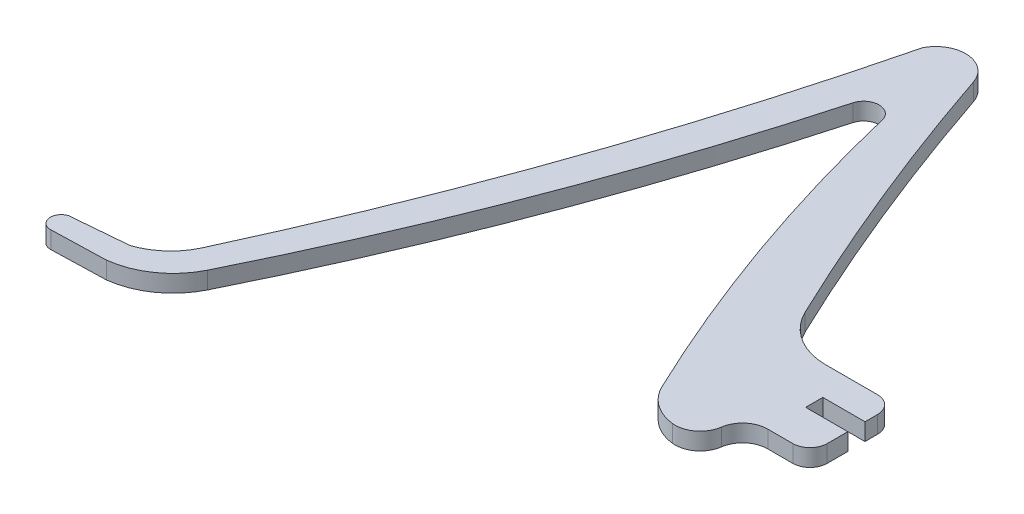
ISO-10303-21;
HEADER;
FILE_DESCRIPTION(('STEP AP214'),'2;1');
FILE_NAME('part.step','',(''),(''),'','','');
FILE_SCHEMA(('AUTOMOTIVE_DESIGN { 1 0 10303 214 1 1 1 1 }'));
ENDSEC;
DATA;
#1=APPLICATION_CONTEXT('core data for automotive mechanical design processes');
#2=APPLICATION_PROTOCOL_DEFINITION('international standard','automotive_design',2000,#1);
#3=PRODUCT_CONTEXT('',#1,'mechanical');
#4=PRODUCT('Part','Part','',(#3));
#5=PRODUCT_RELATED_PRODUCT_CATEGORY('part','',(#4));
#6=PRODUCT_DEFINITION_FORMATION('','',#4);
#7=PRODUCT_DEFINITION_CONTEXT('part definition',#1,'design');
#8=PRODUCT_DEFINITION('design','',#6,#7);
#9=PRODUCT_DEFINITION_SHAPE('','',#8);
#10=(LENGTH_UNIT() NAMED_UNIT(*) SI_UNIT(.MILLI.,.METRE.));
#11=(NAMED_UNIT(*) PLANE_ANGLE_UNIT() SI_UNIT($,.RADIAN.));
#12=(NAMED_UNIT(*) SI_UNIT($,.STERADIAN.) SOLID_ANGLE_UNIT());
#13=UNCERTAINTY_MEASURE_WITH_UNIT(LENGTH_MEASURE(1.E-05),#10,'distance_accuracy_value','');
#14=(GEOMETRIC_REPRESENTATION_CONTEXT(3) GLOBAL_UNCERTAINTY_ASSIGNED_CONTEXT((#13)) GLOBAL_UNIT_ASSIGNED_CONTEXT((#10,
#11,#12)) REPRESENTATION_CONTEXT('',''));
#15=CARTESIAN_POINT('',(0.,0.,0.));
#16=DIRECTION('',(0.,0.,1.));
#17=DIRECTION('',(1.,0.,0.));
#18=AXIS2_PLACEMENT_3D('',#15,#16,#17);
#19=CARTESIAN_POINT('',(-41735.625000019,3.,-18254.4492183755));
#20=DIRECTION('',(0.,-1.,0.));
#21=DIRECTION('',(0.,0.,-1.));
#22=AXIS2_PLACEMENT_3D('',#19,#20,#21);
#23=CYLINDRICAL_SURFACE('',#22,1.87725105910112);
#24=CARTESIAN_POINT('',(-41735.625000019,0.,-18254.4492183755));
#25=DIRECTION('',(0.,1.,0.));
#26=DIRECTION('',(0.,0.,1.));
#27=AXIS2_PLACEMENT_3D('',#24,#25,#26);
#28=CIRCLE('',#27,1.87725105910112);
#29=CARTESIAN_POINT('',(-41735.457558,0.,-18256.318987));
#30=VERTEX_POINT('',#29);
#31=CARTESIAN_POINT('',(-41735.572271,0.,-18252.572708));
#32=VERTEX_POINT('',#31);
#33=EDGE_CURVE('E227',#30,#32,#28,.T.);
#34=ORIENTED_EDGE('',*,*,#33,.T.);
#35=DIRECTION('',(0.,-1.,0.));
#36=VECTOR('',#35,1.);
#37=CARTESIAN_POINT('',(-41735.572271,3.,-18252.572708));
#38=LINE('',#37,#36);
#39=CARTESIAN_POINT('',(-41735.572271,3.,-18252.572708));
#40=VERTEX_POINT('',#39);
#41=EDGE_CURVE('E11',#40,#32,#38,.T.);
#42=ORIENTED_EDGE('',*,*,#41,.F.);
#43=CARTESIAN_POINT('',(-41735.625000019,3.,-18254.4492183755));
#44=DIRECTION('',(0.,1.,0.));
#45=DIRECTION('',(0.,0.,1.));
#46=AXIS2_PLACEMENT_3D('',#43,#44,#45);
#47=CIRCLE('',#46,1.87725105910112);
#48=CARTESIAN_POINT('',(-41735.457558,3.,-18256.318987));
#49=VERTEX_POINT('',#48);
#50=EDGE_CURVE('E273',#49,#40,#47,.T.);
#51=ORIENTED_EDGE('',*,*,#50,.F.);
#52=DIRECTION('',(0.,-1.,0.));
#53=VECTOR('',#52,1.);
#54=CARTESIAN_POINT('',(-41735.457558,3.,-18256.318987));
#55=LINE('',#54,#53);
#56=EDGE_CURVE('E223',#49,#30,#55,.T.);
#57=ORIENTED_EDGE('',*,*,#56,.T.);
#58=EDGE_LOOP('',(#34,#42,#51,#57));
#59=FACE_BOUND('',#58,.T.);
#60=ADVANCED_FACE('F35',(#59),#23,.T.);
#61=CARTESIAN_POINT('',(-41735.572271,3.,-18252.572708));
#62=DIRECTION('',(-0.0283472099068102,0.,-0.999598137098354));
#63=DIRECTION('',(-0.999598137098354,0.,0.0283472099068102));
#64=AXIS2_PLACEMENT_3D('',#61,#62,#63);
#65=PLANE('',#64);
#66=DIRECTION('',(0.999598137098354,0.,-0.0283472099068102));
#67=VECTOR('',#66,1.);
#68=CARTESIAN_POINT('',(-41735.572271,0.,-18252.572708));
#69=LINE('',#68,#67);
#70=CARTESIAN_POINT('',(-41726.152344,0.,-18252.839844));
#71=VERTEX_POINT('',#70);
#72=EDGE_CURVE('E230',#32,#71,#69,.T.);
#73=ORIENTED_EDGE('',*,*,#72,.T.);
#74=DIRECTION('',(0.,-1.,0.));
#75=VECTOR('',#74,1.);
#76=CARTESIAN_POINT('',(-41726.152344,3.,-18252.839844));
#77=LINE('',#76,#75);
#78=CARTESIAN_POINT('',(-41726.152344,3.,-18252.839844));
#79=VERTEX_POINT('',#78);
#80=EDGE_CURVE('E43',#79,#71,#77,.T.);
#81=ORIENTED_EDGE('',*,*,#80,.F.);
#82=DIRECTION('',(0.999598137098354,0.,-0.0283472099068102));
#83=VECTOR('',#82,1.);
#84=CARTESIAN_POINT('',(-41735.572271,3.,-18252.572708));
#85=LINE('',#84,#83);
#86=EDGE_CURVE('E142',#40,#79,#85,.T.);
#87=ORIENTED_EDGE('',*,*,#86,.F.);
#88=ORIENTED_EDGE('',*,*,#41,.T.);
#89=EDGE_LOOP('',(#73,#81,#87,#88));
#90=FACE_BOUND('',#89,.T.);
#91=ADVANCED_FACE('F411',(#90),#65,.F.);
#92=CARTESIAN_POINT('',(-41727.6986479715,3.,-18266.0433719861));
#93=DIRECTION('',(0.,-1.,0.));
#94=DIRECTION('',(0.,0.,-1.));
#95=AXIS2_PLACEMENT_3D('',#92,#93,#94);
#96=CYLINDRICAL_SURFACE('',#95,13.2937657287983);
#97=CARTESIAN_POINT('',(-41727.6986479715,0.,-18266.0433719861));
#98=DIRECTION('',(0.,1.,0.));
#99=DIRECTION('',(0.,0.,1.));
#100=AXIS2_PLACEMENT_3D('',#97,#98,#99);
#101=CIRCLE('',#100,13.2937657287983);
#102=CARTESIAN_POINT('',(-41715.7765399999,0.,-18260.162254));
#103=VERTEX_POINT('',#102);
#104=EDGE_CURVE('E232',#71,#103,#101,.T.);
#105=ORIENTED_EDGE('',*,*,#104,.T.);
#106=DIRECTION('',(0.,-1.,0.));
#107=VECTOR('',#106,1.);
#108=CARTESIAN_POINT('',(-41715.7765399999,3.,-18260.162254));
#109=LINE('',#108,#107);
#110=CARTESIAN_POINT('',(-41715.7765399999,3.,-18260.162254));
#111=VERTEX_POINT('',#110);
#112=EDGE_CURVE('E328',#111,#103,#109,.T.);
#113=ORIENTED_EDGE('',*,*,#112,.F.);
#114=CARTESIAN_POINT('',(-41727.6986479715,3.,-18266.0433719861));
#115=DIRECTION('',(0.,1.,0.));
#116=DIRECTION('',(0.,0.,1.));
#117=AXIS2_PLACEMENT_3D('',#114,#115,#116);
#118=CIRCLE('',#117,13.2937657287983);
#119=EDGE_CURVE('E336',#79,#111,#118,.T.);
#120=ORIENTED_EDGE('',*,*,#119,.F.);
#121=ORIENTED_EDGE('',*,*,#80,.T.);
#122=EDGE_LOOP('',(#105,#113,#120,#121));
#123=FACE_BOUND('',#122,.T.);
#124=ADVANCED_FACE('F334',(#123),#96,.T.);
#125=CARTESIAN_POINT('',(-42128.6616567042,3.,-18463.785625262));
#126=DIRECTION('',(0.,-1.,0.));
#127=DIRECTION('',(0.,0.,-1.));
#128=AXIS2_PLACEMENT_3D('',#125,#126,#127);
#129=CYLINDRICAL_SURFACE('',#128,460.365720835098);
#130=CARTESIAN_POINT('',(-42128.6616567042,0.,-18463.785625262));
#131=DIRECTION('',(0.,1.,0.));
#132=DIRECTION('',(0.,0.,1.));
#133=AXIS2_PLACEMENT_3D('',#130,#131,#132);
#134=CIRCLE('',#133,460.365720835098);
#135=CARTESIAN_POINT('',(-41684.7636980001,0.,-18341.7561239999));
#136=VERTEX_POINT('',#135);
#137=EDGE_CURVE('E234',#103,#136,#134,.T.);
#138=ORIENTED_EDGE('',*,*,#137,.T.);
#139=DIRECTION('',(0.,-1.,0.));
#140=VECTOR('',#139,1.);
#141=CARTESIAN_POINT('',(-41684.7636980001,3.,-18341.7561239999));
#142=LINE('',#141,#140);
#143=CARTESIAN_POINT('',(-41684.7636980001,3.,-18341.7561239999));
#144=VERTEX_POINT('',#143);
#145=EDGE_CURVE('E325',#144,#136,#142,.T.);
#146=ORIENTED_EDGE('',*,*,#145,.F.);
#147=CARTESIAN_POINT('',(-42128.6616567042,3.,-18463.785625262));
#148=DIRECTION('',(0.,1.,0.));
#149=DIRECTION('',(0.,0.,1.));
#150=AXIS2_PLACEMENT_3D('',#147,#148,#149);
#151=CIRCLE('',#150,460.365720835098);
#152=EDGE_CURVE('E354',#111,#144,#151,.T.);
#153=ORIENTED_EDGE('',*,*,#152,.F.);
#154=ORIENTED_EDGE('',*,*,#112,.T.);
#155=EDGE_LOOP('',(#138,#146,#153,#154));
#156=FACE_BOUND('',#155,.T.);
#157=ADVANCED_FACE('F345',(#156),#129,.T.);
#158=CARTESIAN_POINT('',(-41682.171002211,3.,-18341.0430255174));
#159=DIRECTION('',(0.,-1.,0.));
#160=DIRECTION('',(0.,0.,-1.));
#161=AXIS2_PLACEMENT_3D('',#158,#159,#160);
#162=CYLINDRICAL_SURFACE('',#161,2.6889739493658);
#163=CARTESIAN_POINT('',(-41682.171002211,0.,-18341.0430255174));
#164=DIRECTION('',(0.,-1.,0.));
#165=DIRECTION('',(0.,0.,1.));
#166=AXIS2_PLACEMENT_3D('',#163,#164,#165);
#167=CIRCLE('',#166,2.6889739493658);
#168=CARTESIAN_POINT('',(-41679.691927,0.,-18342.084547));
#169=VERTEX_POINT('',#168);
#170=EDGE_CURVE('E236',#136,#169,#167,.T.);
#171=ORIENTED_EDGE('',*,*,#170,.T.);
#172=DIRECTION('',(0.,-1.,0.));
#173=VECTOR('',#172,1.);
#174=CARTESIAN_POINT('',(-41679.691927,3.,-18342.084547));
#175=LINE('',#174,#173);
#176=CARTESIAN_POINT('',(-41679.691927,3.,-18342.084547));
#177=VERTEX_POINT('',#176);
#178=EDGE_CURVE('E322',#177,#169,#175,.T.);
#179=ORIENTED_EDGE('',*,*,#178,.F.);
#180=CARTESIAN_POINT('',(-41682.171002211,3.,-18341.0430255174));
#181=DIRECTION('',(0.,-1.,0.));
#182=DIRECTION('',(0.,0.,1.));
#183=AXIS2_PLACEMENT_3D('',#180,#181,#182);
#184=CIRCLE('',#183,2.6889739493658);
#185=EDGE_CURVE('E351',#144,#177,#184,.T.);
#186=ORIENTED_EDGE('',*,*,#185,.F.);
#187=ORIENTED_EDGE('',*,*,#145,.T.);
#188=EDGE_LOOP('',(#171,#179,#186,#187));
#189=FACE_BOUND('',#188,.T.);
#190=ADVANCED_FACE('F349',(#189),#162,.F.);
#191=CARTESIAN_POINT('',(-41387.5740004208,3.,-18411.7109974859));
#192=DIRECTION('',(0.,-1.,0.));
#193=DIRECTION('',(0.,0.,-1.));
#194=AXIS2_PLACEMENT_3D('',#191,#192,#193);
#195=CYLINDRICAL_SURFACE('',#194,300.3010583335);
#196=CARTESIAN_POINT('',(-41387.5740004208,0.,-18411.7109974859));
#197=DIRECTION('',(0.,1.,0.));
#198=DIRECTION('',(0.,0.,1.));
#199=AXIS2_PLACEMENT_3D('',#196,#197,#198);
#200=CIRCLE('',#199,300.3010583335);
#201=CARTESIAN_POINT('',(-41658.4870259999,0.,-18282.1468889999));
#202=VERTEX_POINT('',#201);
#203=EDGE_CURVE('E238',#169,#202,#200,.T.);
#204=ORIENTED_EDGE('',*,*,#203,.T.);
#205=DIRECTION('',(0.,-1.,0.));
#206=VECTOR('',#205,1.);
#207=CARTESIAN_POINT('',(-41658.4870259999,3.,-18282.1468889999));
#208=LINE('',#207,#206);
#209=CARTESIAN_POINT('',(-41658.4870259999,3.,-18282.1468889999));
#210=VERTEX_POINT('',#209);
#211=EDGE_CURVE('E319',#210,#202,#208,.T.);
#212=ORIENTED_EDGE('',*,*,#211,.F.);
#213=CARTESIAN_POINT('',(-41387.5740004208,3.,-18411.7109974859));
#214=DIRECTION('',(0.,1.,0.));
#215=DIRECTION('',(0.,0.,1.));
#216=AXIS2_PLACEMENT_3D('',#213,#214,#215);
#217=CIRCLE('',#216,300.3010583335);
#218=EDGE_CURVE('E353',#177,#210,#217,.T.);
#219=ORIENTED_EDGE('',*,*,#218,.F.);
#220=ORIENTED_EDGE('',*,*,#178,.T.);
#221=EDGE_LOOP('',(#204,#212,#219,#220));
#222=FACE_BOUND('',#221,.T.);
#223=ADVANCED_FACE('F424',(#222),#195,.T.);
#224=CARTESIAN_POINT('',(-41651.1032537113,3.,-18285.6789434485));
#225=DIRECTION('',(0.,-1.,0.));
#226=DIRECTION('',(0.,0.,-1.));
#227=AXIS2_PLACEMENT_3D('',#224,#225,#226);
#228=CYLINDRICAL_SURFACE('',#227,8.1850779983004);
#229=CARTESIAN_POINT('',(-41651.1032537113,0.,-18285.6789434485));
#230=DIRECTION('',(0.,1.,0.));
#231=DIRECTION('',(0.,0.,1.));
#232=AXIS2_PLACEMENT_3D('',#229,#230,#231);
#233=CIRCLE('',#232,8.1850779983004);
#234=CARTESIAN_POINT('',(-41652.056541,0.,-18277.5495679999));
#235=VERTEX_POINT('',#234);
#236=EDGE_CURVE('E240',#202,#235,#233,.T.);
#237=ORIENTED_EDGE('',*,*,#236,.T.);
#238=DIRECTION('',(0.,-1.,0.));
#239=VECTOR('',#238,1.);
#240=CARTESIAN_POINT('',(-41652.056541,3.,-18277.5495679999));
#241=LINE('',#240,#239);
#242=CARTESIAN_POINT('',(-41652.056541,3.,-18277.5495679999));
#243=VERTEX_POINT('',#242);
#244=EDGE_CURVE('E316',#243,#235,#241,.T.);
#245=ORIENTED_EDGE('',*,*,#244,.F.);
#246=CARTESIAN_POINT('',(-41651.1032537113,3.,-18285.6789434485));
#247=DIRECTION('',(0.,1.,0.));
#248=DIRECTION('',(0.,0.,1.));
#249=AXIS2_PLACEMENT_3D('',#246,#247,#248);
#250=CIRCLE('',#249,8.1850779983004);
#251=EDGE_CURVE('E356',#210,#243,#250,.T.);
#252=ORIENTED_EDGE('',*,*,#251,.F.);
#253=ORIENTED_EDGE('',*,*,#211,.T.);
#254=EDGE_LOOP('',(#237,#245,#252,#253));
#255=FACE_BOUND('',#254,.T.);
#256=ADVANCED_FACE('F427',(#255),#228,.T.);
#257=CARTESIAN_POINT('',(-41651.5439153438,3.,-18281.889896786));
#258=DIRECTION('',(0.,-1.,0.));
#259=DIRECTION('',(0.,0.,-1.));
#260=AXIS2_PLACEMENT_3D('',#257,#258,#259);
#261=CYLINDRICAL_SURFACE('',#260,4.37049642879947);
#262=CARTESIAN_POINT('',(-41651.5439153438,0.,-18281.889896786));
#263=DIRECTION('',(0.,1.,0.));
#264=DIRECTION('',(0.,0.,1.));
#265=AXIS2_PLACEMENT_3D('',#262,#263,#264);
#266=CIRCLE('',#265,4.37049642879947);
#267=CARTESIAN_POINT('',(-41647.2171,0.,-18281.27353));
#268=VERTEX_POINT('',#267);
#269=EDGE_CURVE('E242',#235,#268,#266,.T.);
#270=ORIENTED_EDGE('',*,*,#269,.T.);
#271=DIRECTION('',(0.,-1.,0.));
#272=VECTOR('',#271,1.);
#273=CARTESIAN_POINT('',(-41647.2171,3.,-18281.27353));
#274=LINE('',#273,#272);
#275=CARTESIAN_POINT('',(-41647.2171,3.,-18281.27353));
#276=VERTEX_POINT('',#275);
#277=EDGE_CURVE('E313',#276,#268,#274,.T.);
#278=ORIENTED_EDGE('',*,*,#277,.F.);
#279=CARTESIAN_POINT('',(-41651.5439153438,3.,-18281.889896786));
#280=DIRECTION('',(0.,1.,0.));
#281=DIRECTION('',(0.,0.,1.));
#282=AXIS2_PLACEMENT_3D('',#279,#280,#281);
#283=CIRCLE('',#282,4.37049642879947);
#284=EDGE_CURVE('E362',#243,#276,#283,.T.);
#285=ORIENTED_EDGE('',*,*,#284,.F.);
#286=ORIENTED_EDGE('',*,*,#244,.T.);
#287=EDGE_LOOP('',(#270,#278,#285,#286));
#288=FACE_BOUND('',#287,.T.);
#289=ADVANCED_FACE('F431',(#288),#261,.T.);
#290=CARTESIAN_POINT('',(-41642.9057210753,3.,-18280.6586579535));
#291=DIRECTION('',(0.,-1.,0.));
#292=DIRECTION('',(0.,0.,-1.));
#293=AXIS2_PLACEMENT_3D('',#290,#291,#292);
#294=CYLINDRICAL_SURFACE('',#293,4.35500354371841);
#295=CARTESIAN_POINT('',(-41642.9057210753,0.,-18280.6586579535));
#296=DIRECTION('',(0.,-1.,0.));
#297=DIRECTION('',(0.,0.,1.));
#298=AXIS2_PLACEMENT_3D('',#295,#296,#297);
#299=CIRCLE('',#298,4.35500354371841);
#300=CARTESIAN_POINT('',(-41642.869038,0.,-18285.013507));
#301=VERTEX_POINT('',#300);
#302=EDGE_CURVE('E244',#268,#301,#299,.T.);
#303=ORIENTED_EDGE('',*,*,#302,.T.);
#304=DIRECTION('',(0.,-1.,0.));
#305=VECTOR('',#304,1.);
#306=CARTESIAN_POINT('',(-41642.869038,3.,-18285.013507));
#307=LINE('',#306,#305);
#308=CARTESIAN_POINT('',(-41642.869038,3.,-18285.013507));
#309=VERTEX_POINT('',#308);
#310=EDGE_CURVE('E310',#309,#301,#307,.T.);
#311=ORIENTED_EDGE('',*,*,#310,.F.);
#312=CARTESIAN_POINT('',(-41642.9057210753,3.,-18280.6586579535));
#313=DIRECTION('',(0.,-1.,0.));
#314=DIRECTION('',(0.,0.,1.));
#315=AXIS2_PLACEMENT_3D('',#312,#313,#314);
#316=CIRCLE('',#315,4.35500354371841);
#317=EDGE_CURVE('E364',#276,#309,#316,.T.);
#318=ORIENTED_EDGE('',*,*,#317,.F.);
#319=ORIENTED_EDGE('',*,*,#277,.T.);
#320=EDGE_LOOP('',(#303,#311,#318,#319));
#321=FACE_BOUND('',#320,.T.);
#322=ADVANCED_FACE('F435',(#321),#294,.F.);
#323=CARTESIAN_POINT('',(-41642.869038,3.,-18285.013507));
#324=DIRECTION('',(-3.77320231391761E-05,0.,-0.999999999288147));
#325=DIRECTION('',(-0.999999999288147,0.,3.77320231391761E-05));
#326=AXIS2_PLACEMENT_3D('',#323,#324,#325);
#327=PLANE('',#326);
#328=DIRECTION('',(0.999999999288147,0.,-3.77320231391761E-05));
#329=VECTOR('',#328,1.);
#330=CARTESIAN_POINT('',(-41642.869038,0.,-18285.013507));
#331=LINE('',#330,#329);
#332=CARTESIAN_POINT('',(-41638.496094,0.,-18285.013672));
#333=VERTEX_POINT('',#332);
#334=EDGE_CURVE('E246',#301,#333,#331,.T.);
#335=ORIENTED_EDGE('',*,*,#334,.T.);
#336=DIRECTION('',(0.,-1.,0.));
#337=VECTOR('',#336,1.);
#338=CARTESIAN_POINT('',(-41638.496094,3.,-18285.013672));
#339=LINE('',#338,#337);
#340=CARTESIAN_POINT('',(-41638.496094,3.,-18285.013672));
#341=VERTEX_POINT('',#340);
#342=EDGE_CURVE('E307',#341,#333,#339,.T.);
#343=ORIENTED_EDGE('',*,*,#342,.F.);
#344=DIRECTION('',(0.999999999288147,0.,-3.77320231391761E-05));
#345=VECTOR('',#344,1.);
#346=CARTESIAN_POINT('',(-41642.869038,3.,-18285.013507));
#347=LINE('',#346,#345);
#348=EDGE_CURVE('E366',#309,#341,#347,.T.);
#349=ORIENTED_EDGE('',*,*,#348,.F.);
#350=ORIENTED_EDGE('',*,*,#310,.T.);
#351=EDGE_LOOP('',(#335,#343,#349,#350));
#352=FACE_BOUND('',#351,.T.);
#353=ADVANCED_FACE('F439',(#352),#327,.F.);
#354=CARTESIAN_POINT('',(-41638.4970694779,3.,-18288.014648383));
#355=DIRECTION('',(0.,-1.,0.));
#356=DIRECTION('',(0.,0.,-1.));
#357=AXIS2_PLACEMENT_3D('',#354,#355,#356);
#358=CYLINDRICAL_SURFACE('',#357,3.00097654149968);
#359=CARTESIAN_POINT('',(-41638.4970694779,0.,-18288.014648383));
#360=DIRECTION('',(0.,1.,0.));
#361=DIRECTION('',(0.,0.,1.));
#362=AXIS2_PLACEMENT_3D('',#359,#360,#361);
#363=CIRCLE('',#362,3.00097654149968);
#364=CARTESIAN_POINT('',(-41635.496094,0.,-18288.017175));
#365=VERTEX_POINT('',#364);
#366=EDGE_CURVE('E248',#333,#365,#363,.T.);
#367=ORIENTED_EDGE('',*,*,#366,.T.);
#368=DIRECTION('',(0.,-1.,0.));
#369=VECTOR('',#368,1.);
#370=CARTESIAN_POINT('',(-41635.496094,3.,-18288.017175));
#371=LINE('',#370,#369);
#372=CARTESIAN_POINT('',(-41635.496094,3.,-18288.017175));
#373=VERTEX_POINT('',#372);
#374=EDGE_CURVE('E304',#373,#365,#371,.T.);
#375=ORIENTED_EDGE('',*,*,#374,.F.);
#376=CARTESIAN_POINT('',(-41638.4970694779,3.,-18288.014648383));
#377=DIRECTION('',(0.,1.,0.));
#378=DIRECTION('',(0.,0.,1.));
#379=AXIS2_PLACEMENT_3D('',#376,#377,#378);
#380=CIRCLE('',#379,3.00097654149968);
#381=EDGE_CURVE('E368',#341,#373,#380,.T.);
#382=ORIENTED_EDGE('',*,*,#381,.F.);
#383=ORIENTED_EDGE('',*,*,#342,.T.);
#384=EDGE_LOOP('',(#367,#375,#382,#383));
#385=FACE_BOUND('',#384,.T.);
#386=ADVANCED_FACE('F443',(#385),#358,.T.);
#387=CARTESIAN_POINT('',(-41635.496094,3.,-18288.017175));
#388=DIRECTION('',(-1.,0.,-3.95388140552387E-12));
#389=DIRECTION('',(-3.95388140552387E-12,0.,1.));
#390=AXIS2_PLACEMENT_3D('',#387,#388,#389);
#391=PLANE('',#390);
#392=DIRECTION('',(3.95388140552387E-12,0.,-1.));
#393=VECTOR('',#392,1.);
#394=CARTESIAN_POINT('',(-41635.496094,0.,-18288.017175));
#395=LINE('',#394,#393);
#396=CARTESIAN_POINT('',(-41635.496094,0.,-18291.611328));
#397=VERTEX_POINT('',#396);
#398=EDGE_CURVE('E250',#365,#397,#395,.T.);
#399=ORIENTED_EDGE('',*,*,#398,.T.);
#400=DIRECTION('',(0.,-1.,0.));
#401=VECTOR('',#400,1.);
#402=CARTESIAN_POINT('',(-41635.496094,3.,-18291.611328));
#403=LINE('',#402,#401);
#404=CARTESIAN_POINT('',(-41635.496094,3.,-18291.611328));
#405=VERTEX_POINT('',#404);
#406=EDGE_CURVE('E301',#405,#397,#403,.T.);
#407=ORIENTED_EDGE('',*,*,#406,.F.);
#408=DIRECTION('',(3.95388140552387E-12,0.,-1.));
#409=VECTOR('',#408,1.);
#410=CARTESIAN_POINT('',(-41635.496094,3.,-18288.017175));
#411=LINE('',#410,#409);
#412=EDGE_CURVE('E370',#373,#405,#411,.T.);
#413=ORIENTED_EDGE('',*,*,#412,.F.);
#414=ORIENTED_EDGE('',*,*,#374,.T.);
#415=EDGE_LOOP('',(#399,#407,#413,#414));
#416=FACE_BOUND('',#415,.T.);
#417=ADVANCED_FACE('F447',(#416),#391,.F.);
#418=CARTESIAN_POINT('',(-41635.496094,3.,-18291.611328));
#419=DIRECTION('',(0.,0.,1.));
#420=DIRECTION('',(1.,0.,0.));
#421=AXIS2_PLACEMENT_3D('',#418,#419,#420);
#422=PLANE('',#421);
#423=DIRECTION('',(-1.,0.,0.));
#424=VECTOR('',#423,1.);
#425=CARTESIAN_POINT('',(-41635.496094,0.,-18291.611328));
#426=LINE('',#425,#424);
#427=CARTESIAN_POINT('',(-41642.855469,0.,-18291.611328));
#428=VERTEX_POINT('',#427);
#429=EDGE_CURVE('E252',#397,#428,#426,.T.);
#430=ORIENTED_EDGE('',*,*,#429,.T.);
#431=DIRECTION('',(0.,-1.,0.));
#432=VECTOR('',#431,1.);
#433=CARTESIAN_POINT('',(-41642.855469,3.,-18291.611328));
#434=LINE('',#433,#432);
#435=CARTESIAN_POINT('',(-41642.855469,3.,-18291.611328));
#436=VERTEX_POINT('',#435);
#437=EDGE_CURVE('E298',#436,#428,#434,.T.);
#438=ORIENTED_EDGE('',*,*,#437,.F.);
#439=DIRECTION('',(-1.,0.,0.));
#440=VECTOR('',#439,1.);
#441=CARTESIAN_POINT('',(-41635.496094,3.,-18291.611328));
#442=LINE('',#441,#440);
#443=EDGE_CURVE('E372',#405,#436,#442,.T.);
#444=ORIENTED_EDGE('',*,*,#443,.F.);
#445=ORIENTED_EDGE('',*,*,#406,.T.);
#446=EDGE_LOOP('',(#430,#438,#444,#445));
#447=FACE_BOUND('',#446,.T.);
#448=ADVANCED_FACE('F451',(#447),#422,.F.);
#449=CARTESIAN_POINT('',(-41642.855469,3.,-18291.611328));
#450=DIRECTION('',(-0.999999152399079,0.,0.00130199889520163));
#451=DIRECTION('',(0.00130199889520163,0.,0.999999152399079));
#452=AXIS2_PLACEMENT_3D('',#449,#450,#451);
#453=PLANE('',#452);
#454=DIRECTION('',(-0.00130199889520163,0.,-0.999999152399079));
#455=VECTOR('',#454,1.);
#456=CARTESIAN_POINT('',(-41642.855469,0.,-18291.611328));
#457=LINE('',#456,#455);
#458=CARTESIAN_POINT('',(-41642.859375,0.,-18294.611328));
#459=VERTEX_POINT('',#458);
#460=EDGE_CURVE('E254',#428,#459,#457,.T.);
#461=ORIENTED_EDGE('',*,*,#460,.T.);
#462=DIRECTION('',(0.,-1.,0.));
#463=VECTOR('',#462,1.);
#464=CARTESIAN_POINT('',(-41642.859375,3.,-18294.611328));
#465=LINE('',#464,#463);
#466=CARTESIAN_POINT('',(-41642.859375,3.,-18294.611328));
#467=VERTEX_POINT('',#466);
#468=EDGE_CURVE('E295',#467,#459,#465,.T.);
#469=ORIENTED_EDGE('',*,*,#468,.F.);
#470=DIRECTION('',(-0.00130199889520163,0.,-0.999999152399079));
#471=VECTOR('',#470,1.);
#472=CARTESIAN_POINT('',(-41642.855469,3.,-18291.611328));
#473=LINE('',#472,#471);
#474=EDGE_CURVE('E374',#436,#467,#473,.T.);
#475=ORIENTED_EDGE('',*,*,#474,.F.);
#476=ORIENTED_EDGE('',*,*,#437,.T.);
#477=EDGE_LOOP('',(#461,#469,#475,#476));
#478=FACE_BOUND('',#477,.T.);
#479=ADVANCED_FACE('F455',(#478),#453,.F.);
#480=CARTESIAN_POINT('',(-41642.859375,3.,-18294.611328));
#481=DIRECTION('',(0.,0.,-1.));
#482=DIRECTION('',(-1.,0.,0.));
#483=AXIS2_PLACEMENT_3D('',#480,#481,#482);
#484=PLANE('',#483);
#485=DIRECTION('',(1.,0.,0.));
#486=VECTOR('',#485,1.);
#487=CARTESIAN_POINT('',(-41642.859375,0.,-18294.611328));
#488=LINE('',#487,#486);
#489=CARTESIAN_POINT('',(-41635.5,0.,-18294.611328));
#490=VERTEX_POINT('',#489);
#491=EDGE_CURVE('E256',#459,#490,#488,.T.);
#492=ORIENTED_EDGE('',*,*,#491,.T.);
#493=DIRECTION('',(0.,-1.,0.));
#494=VECTOR('',#493,1.);
#495=CARTESIAN_POINT('',(-41635.5,3.,-18294.611328));
#496=LINE('',#495,#494);
#497=CARTESIAN_POINT('',(-41635.5,3.,-18294.611328));
#498=VERTEX_POINT('',#497);
#499=EDGE_CURVE('E292',#498,#490,#496,.T.);
#500=ORIENTED_EDGE('',*,*,#499,.F.);
#501=DIRECTION('',(1.,0.,0.));
#502=VECTOR('',#501,1.);
#503=CARTESIAN_POINT('',(-41642.859375,3.,-18294.611328));
#504=LINE('',#503,#502);
#505=EDGE_CURVE('E376',#467,#498,#504,.T.);
#506=ORIENTED_EDGE('',*,*,#505,.F.);
#507=ORIENTED_EDGE('',*,*,#468,.T.);
#508=EDGE_LOOP('',(#492,#500,#506,#507));
#509=FACE_BOUND('',#508,.T.);
#510=ADVANCED_FACE('F459',(#509),#484,.F.);
#511=CARTESIAN_POINT('',(-41635.5,3.,-18294.611328));
#512=DIRECTION('',(-0.999998402969758,0.,-0.00178719275235355));
#513=DIRECTION('',(-0.00178719275235355,0.,0.999998402969758));
#514=AXIS2_PLACEMENT_3D('',#511,#512,#513);
#515=PLANE('',#514);
#516=DIRECTION('',(0.00178719275235355,0.,-0.999998402969758));
#517=VECTOR('',#516,1.);
#518=CARTESIAN_POINT('',(-41635.5,0.,-18294.611328));
#519=LINE('',#518,#517);
#520=CARTESIAN_POINT('',(-41635.496094,0.,-18296.796875));
#521=VERTEX_POINT('',#520);
#522=EDGE_CURVE('E258',#490,#521,#519,.T.);
#523=ORIENTED_EDGE('',*,*,#522,.T.);
#524=DIRECTION('',(0.,-1.,0.));
#525=VECTOR('',#524,1.);
#526=CARTESIAN_POINT('',(-41635.496094,3.,-18296.796875));
#527=LINE('',#526,#525);
#528=CARTESIAN_POINT('',(-41635.496094,3.,-18296.796875));
#529=VERTEX_POINT('',#528);
#530=EDGE_CURVE('E289',#529,#521,#527,.T.);
#531=ORIENTED_EDGE('',*,*,#530,.F.);
#532=DIRECTION('',(0.00178719275235355,0.,-0.999998402969758));
#533=VECTOR('',#532,1.);
#534=CARTESIAN_POINT('',(-41635.5,3.,-18294.611328));
#535=LINE('',#534,#533);
#536=EDGE_CURVE('E378',#498,#529,#535,.T.);
#537=ORIENTED_EDGE('',*,*,#536,.F.);
#538=ORIENTED_EDGE('',*,*,#499,.T.);
#539=EDGE_LOOP('',(#523,#531,#537,#538));
#540=FACE_BOUND('',#539,.T.);
#541=ADVANCED_FACE('F463',(#540),#515,.F.);
#542=CARTESIAN_POINT('',(-41638.496094,3.,-18296.796875));
#543=DIRECTION('',(0.,-1.,0.));
#544=DIRECTION('',(0.,0.,-1.));
#545=AXIS2_PLACEMENT_3D('',#542,#543,#544);
#546=CYLINDRICAL_SURFACE('',#545,3.00000000000011);
#547=CARTESIAN_POINT('',(-41638.496094,0.,-18296.796875));
#548=DIRECTION('',(0.,1.,0.));
#549=DIRECTION('',(0.,0.,1.));
#550=AXIS2_PLACEMENT_3D('',#547,#548,#549);
#551=CIRCLE('',#550,3.00000000000011);
#552=CARTESIAN_POINT('',(-41638.496094,0.,-18299.796875));
#553=VERTEX_POINT('',#552);
#554=EDGE_CURVE('E260',#521,#553,#551,.T.);
#555=ORIENTED_EDGE('',*,*,#554,.T.);
#556=DIRECTION('',(0.,-1.,0.));
#557=VECTOR('',#556,1.);
#558=CARTESIAN_POINT('',(-41638.496094,3.,-18299.796875));
#559=LINE('',#558,#557);
#560=CARTESIAN_POINT('',(-41638.496094,3.,-18299.796875));
#561=VERTEX_POINT('',#560);
#562=EDGE_CURVE('E286',#561,#553,#559,.T.);
#563=ORIENTED_EDGE('',*,*,#562,.F.);
#564=CARTESIAN_POINT('',(-41638.496094,3.,-18296.796875));
#565=DIRECTION('',(0.,1.,0.));
#566=DIRECTION('',(0.,0.,1.));
#567=AXIS2_PLACEMENT_3D('',#564,#565,#566);
#568=CIRCLE('',#567,3.00000000000011);
#569=EDGE_CURVE('E380',#529,#561,#568,.T.);
#570=ORIENTED_EDGE('',*,*,#569,.F.);
#571=ORIENTED_EDGE('',*,*,#530,.T.);
#572=EDGE_LOOP('',(#555,#563,#570,#571));
#573=FACE_BOUND('',#572,.T.);
#574=ADVANCED_FACE('F467',(#573),#546,.T.);
#575=CARTESIAN_POINT('',(-41638.496094,3.,-18299.796875));
#576=DIRECTION('',(0.000209894211861232,0.,0.99999997797221));
#577=DIRECTION('',(0.99999997797221,0.,-0.000209894211861232));
#578=AXIS2_PLACEMENT_3D('',#575,#576,#577);
#579=PLANE('',#578);
#580=DIRECTION('',(-0.99999997797221,0.,0.000209894211861232));
#581=VECTOR('',#580,1.);
#582=CARTESIAN_POINT('',(-41638.496094,0.,-18299.796875));
#583=LINE('',#582,#581);
#584=CARTESIAN_POINT('',(-41647.800781,0.,-18299.794922));
#585=VERTEX_POINT('',#584);
#586=EDGE_CURVE('E262',#553,#585,#583,.T.);
#587=ORIENTED_EDGE('',*,*,#586,.T.);
#588=DIRECTION('',(0.,-1.,0.));
#589=VECTOR('',#588,1.);
#590=CARTESIAN_POINT('',(-41647.800781,3.,-18299.794922));
#591=LINE('',#590,#589);
#592=CARTESIAN_POINT('',(-41647.800781,3.,-18299.794922));
#593=VERTEX_POINT('',#592);
#594=EDGE_CURVE('E283',#593,#585,#591,.T.);
#595=ORIENTED_EDGE('',*,*,#594,.F.);
#596=DIRECTION('',(-0.99999997797221,0.,0.000209894211861232));
#597=VECTOR('',#596,1.);
#598=CARTESIAN_POINT('',(-41638.496094,3.,-18299.796875));
#599=LINE('',#598,#597);
#600=EDGE_CURVE('E382',#561,#593,#599,.T.);
#601=ORIENTED_EDGE('',*,*,#600,.F.);
#602=ORIENTED_EDGE('',*,*,#562,.T.);
#603=EDGE_LOOP('',(#587,#595,#601,#602));
#604=FACE_BOUND('',#603,.T.);
#605=ADVANCED_FACE('F471',(#604),#579,.F.);
#606=CARTESIAN_POINT('',(-41647.4981230777,3.,-18310.6472167195));
#607=DIRECTION('',(0.,-1.,0.));
#608=DIRECTION('',(0.,0.,-1.));
#609=AXIS2_PLACEMENT_3D('',#606,#607,#608);
#610=CYLINDRICAL_SURFACE('',#609,10.8565142885037);
#611=CARTESIAN_POINT('',(-41647.4981230777,0.,-18310.6472167195));
#612=DIRECTION('',(0.,-1.,0.));
#613=DIRECTION('',(0.,0.,1.));
#614=AXIS2_PLACEMENT_3D('',#611,#612,#613);
#615=CIRCLE('',#614,10.8565142885037);
#616=CARTESIAN_POINT('',(-41657.2939760001,0.,-18305.9669210003));
#617=VERTEX_POINT('',#616);
#618=EDGE_CURVE('E264',#585,#617,#615,.T.);
#619=ORIENTED_EDGE('',*,*,#618,.T.);
#620=DIRECTION('',(0.,-1.,0.));
#621=VECTOR('',#620,1.);
#622=CARTESIAN_POINT('',(-41657.2939760001,3.,-18305.9669210003));
#623=LINE('',#622,#621);
#624=CARTESIAN_POINT('',(-41657.2939760001,3.,-18305.9669210003));
#625=VERTEX_POINT('',#624);
#626=EDGE_CURVE('E280',#625,#617,#623,.T.);
#627=ORIENTED_EDGE('',*,*,#626,.F.);
#628=CARTESIAN_POINT('',(-41647.4981230777,3.,-18310.6472167195));
#629=DIRECTION('',(0.,-1.,0.));
#630=DIRECTION('',(0.,0.,1.));
#631=AXIS2_PLACEMENT_3D('',#628,#629,#630);
#632=CIRCLE('',#631,10.8565142885037);
#633=EDGE_CURVE('E384',#593,#625,#632,.T.);
#634=ORIENTED_EDGE('',*,*,#633,.F.);
#635=ORIENTED_EDGE('',*,*,#594,.T.);
#636=EDGE_LOOP('',(#619,#627,#634,#635));
#637=FACE_BOUND('',#636,.T.);
#638=ADVANCED_FACE('F475',(#637),#610,.F.);
#639=CARTESIAN_POINT('',(-41255.6337432256,3.,-18497.9731435001));
#640=DIRECTION('',(0.,-1.,0.));
#641=DIRECTION('',(0.,0.,-1.));
#642=AXIS2_PLACEMENT_3D('',#639,#640,#641);
#643=CYLINDRICAL_SURFACE('',#642,445.193589431705);
#644=CARTESIAN_POINT('',(-41255.6337432256,0.,-18497.9731435001));
#645=DIRECTION('',(0.,-1.,0.));
#646=DIRECTION('',(0.,0.,1.));
#647=AXIS2_PLACEMENT_3D('',#644,#645,#646);
#648=CIRCLE('',#647,445.193589431705);
#649=CARTESIAN_POINT('',(-41677.4082949998,0.,-18355.4825839997));
#650=VERTEX_POINT('',#649);
#651=EDGE_CURVE('E266',#617,#650,#648,.T.);
#652=ORIENTED_EDGE('',*,*,#651,.T.);
#653=DIRECTION('',(0.,-1.,0.));
#654=VECTOR('',#653,1.);
#655=CARTESIAN_POINT('',(-41677.4082949998,3.,-18355.4825839997));
#656=LINE('',#655,#654);
#657=CARTESIAN_POINT('',(-41677.4082949998,3.,-18355.4825839997));
#658=VERTEX_POINT('',#657);
#659=EDGE_CURVE('E277',#658,#650,#656,.T.);
#660=ORIENTED_EDGE('',*,*,#659,.F.);
#661=CARTESIAN_POINT('',(-41255.6337432256,3.,-18497.9731435001));
#662=DIRECTION('',(0.,-1.,0.));
#663=DIRECTION('',(0.,0.,1.));
#664=AXIS2_PLACEMENT_3D('',#661,#662,#663);
#665=CIRCLE('',#664,445.193589431705);
#666=EDGE_CURVE('E386',#625,#658,#665,.T.);
#667=ORIENTED_EDGE('',*,*,#666,.F.);
#668=ORIENTED_EDGE('',*,*,#626,.T.);
#669=EDGE_LOOP('',(#652,#660,#667,#668));
#670=FACE_BOUND('',#669,.T.);
#671=ADVANCED_FACE('F392',(#670),#643,.F.);
#672=CARTESIAN_POINT('',(-41682.3550434467,3.,-18353.8124680879));
#673=DIRECTION('',(0.,-1.,0.));
#674=DIRECTION('',(0.,0.,-1.));
#675=AXIS2_PLACEMENT_3D('',#672,#673,#674);
#676=CYLINDRICAL_SURFACE('',#675,5.22107339109885);
#677=CARTESIAN_POINT('',(-41682.3550434467,0.,-18353.8124680879));
#678=DIRECTION('',(0.,1.,0.));
#679=DIRECTION('',(0.,0.,1.));
#680=AXIS2_PLACEMENT_3D('',#677,#678,#679);
#681=CIRCLE('',#680,5.22107339109885);
#682=CARTESIAN_POINT('',(-41686.997382,0.,-18356.201673));
#683=VERTEX_POINT('',#682);
#684=EDGE_CURVE('E268',#650,#683,#681,.T.);
#685=ORIENTED_EDGE('',*,*,#684,.T.);
#686=DIRECTION('',(0.,-1.,0.));
#687=VECTOR('',#686,1.);
#688=CARTESIAN_POINT('',(-41686.997382,3.,-18356.201673));
#689=LINE('',#688,#687);
#690=CARTESIAN_POINT('',(-41686.997382,3.,-18356.201673));
#691=VERTEX_POINT('',#690);
#692=EDGE_CURVE('E218',#691,#683,#689,.T.);
#693=ORIENTED_EDGE('',*,*,#692,.F.);
#694=CARTESIAN_POINT('',(-41682.3550434467,3.,-18353.8124680879));
#695=DIRECTION('',(0.,1.,0.));
#696=DIRECTION('',(0.,0.,1.));
#697=AXIS2_PLACEMENT_3D('',#694,#695,#696);
#698=CIRCLE('',#697,5.22107339109885);
#699=EDGE_CURVE('E209',#658,#691,#698,.T.);
#700=ORIENTED_EDGE('',*,*,#699,.F.);
#701=ORIENTED_EDGE('',*,*,#659,.T.);
#702=EDGE_LOOP('',(#685,#693,#700,#701));
#703=FACE_BOUND('',#702,.T.);
#704=ADVANCED_FACE('F396',(#703),#676,.T.);
#705=CARTESIAN_POINT('',(-42188.2960508927,3.,-18479.4912056574));
#706=DIRECTION('',(0.,-1.,0.));
#707=DIRECTION('',(0.,0.,-1.));
#708=AXIS2_PLACEMENT_3D('',#705,#706,#707);
#709=CYLINDRICAL_SURFACE('',#708,516.237023368626);
#710=CARTESIAN_POINT('',(-42188.2960508927,0.,-18479.4912056574));
#711=DIRECTION('',(0.,-1.,0.));
#712=DIRECTION('',(0.,0.,1.));
#713=AXIS2_PLACEMENT_3D('',#710,#711,#712);
#714=CIRCLE('',#713,516.237023368626);
#715=CARTESIAN_POINT('',(-41719.697677,0.,-18262.8896630001));
#716=VERTEX_POINT('',#715);
#717=EDGE_CURVE('E217',#683,#716,#714,.T.);
#718=ORIENTED_EDGE('',*,*,#717,.T.);
#719=DIRECTION('',(0.,-1.,0.));
#720=VECTOR('',#719,1.);
#721=CARTESIAN_POINT('',(-41719.697677,3.,-18262.8896630001));
#722=LINE('',#721,#720);
#723=CARTESIAN_POINT('',(-41719.697677,3.,-18262.8896630001));
#724=VERTEX_POINT('',#723);
#725=EDGE_CURVE('E214',#724,#716,#722,.T.);
#726=ORIENTED_EDGE('',*,*,#725,.F.);
#727=CARTESIAN_POINT('',(-42188.2960508927,3.,-18479.4912056574));
#728=DIRECTION('',(0.,-1.,0.));
#729=DIRECTION('',(0.,0.,1.));
#730=AXIS2_PLACEMENT_3D('',#727,#728,#729);
#731=CIRCLE('',#730,516.237023368626);
#732=EDGE_CURVE('E203',#691,#724,#731,.T.);
#733=ORIENTED_EDGE('',*,*,#732,.F.);
#734=ORIENTED_EDGE('',*,*,#692,.T.);
#735=EDGE_LOOP('',(#718,#726,#733,#734));
#736=FACE_BOUND('',#735,.T.);
#737=ADVANCED_FACE('F215',(#736),#709,.F.);
#738=CARTESIAN_POINT('',(-41729.8033189134,3.,-18267.7687780849));
#739=DIRECTION('',(0.,-1.,0.));
#740=DIRECTION('',(0.,0.,-1.));
#741=AXIS2_PLACEMENT_3D('',#738,#739,#740);
#742=CYLINDRICAL_SURFACE('',#741,11.2218430969983);
#743=CARTESIAN_POINT('',(-41729.8033189134,0.,-18267.7687780849));
#744=DIRECTION('',(0.,-1.,0.));
#745=DIRECTION('',(0.,0.,1.));
#746=AXIS2_PLACEMENT_3D('',#743,#744,#745);
#747=CIRCLE('',#746,11.2218430969983);
#748=CARTESIAN_POINT('',(-41726.282308,0.,-18257.113627));
#749=VERTEX_POINT('',#748);
#750=EDGE_CURVE('E128',#716,#749,#747,.T.);
#751=ORIENTED_EDGE('',*,*,#750,.T.);
#752=DIRECTION('',(0.,-1.,0.));
#753=VECTOR('',#752,1.);
#754=CARTESIAN_POINT('',(-41726.282308,3.,-18257.113627));
#755=LINE('',#754,#753);
#756=CARTESIAN_POINT('',(-41726.282308,3.,-18257.113627));
#757=VERTEX_POINT('',#756);
#758=EDGE_CURVE('E219',#757,#749,#755,.T.);
#759=ORIENTED_EDGE('',*,*,#758,.F.);
#760=CARTESIAN_POINT('',(-41729.8033189134,3.,-18267.7687780849));
#761=DIRECTION('',(0.,-1.,0.));
#762=DIRECTION('',(0.,0.,1.));
#763=AXIS2_PLACEMENT_3D('',#760,#761,#762);
#764=CIRCLE('',#763,11.2218430969983);
#765=EDGE_CURVE('E207',#724,#757,#764,.T.);
#766=ORIENTED_EDGE('',*,*,#765,.F.);
#767=ORIENTED_EDGE('',*,*,#725,.T.);
#768=EDGE_LOOP('',(#751,#759,#766,#767));
#769=FACE_BOUND('',#768,.T.);
#770=ADVANCED_FACE('F221',(#769),#742,.F.);
#771=CARTESIAN_POINT('',(-41726.282308,3.,-18257.113627));
#772=DIRECTION('',(0.086283911708722,0.,0.996270589037055));
#773=DIRECTION('',(0.996270589037056,0.,-0.0862839117087221));
#774=AXIS2_PLACEMENT_3D('',#771,#772,#773);
#775=PLANE('',#774);
#776=DIRECTION('',(-0.996270589037056,0.,0.0862839117087221));
#777=VECTOR('',#776,1.);
#778=CARTESIAN_POINT('',(-41726.282308,0.,-18257.113627));
#779=LINE('',#778,#777);
#780=EDGE_CURVE('E134',#749,#30,#779,.T.);
#781=ORIENTED_EDGE('',*,*,#780,.T.);
#782=ORIENTED_EDGE('',*,*,#56,.F.);
#783=DIRECTION('',(-0.996270589037056,0.,0.0862839117087221));
#784=VECTOR('',#783,1.);
#785=CARTESIAN_POINT('',(-41726.282308,3.,-18257.113627));
#786=LINE('',#785,#784);
#787=EDGE_CURVE('E51',#757,#49,#786,.T.);
#788=ORIENTED_EDGE('',*,*,#787,.F.);
#789=ORIENTED_EDGE('',*,*,#758,.T.);
#790=EDGE_LOOP('',(#781,#782,#788,#789));
#791=FACE_BOUND('',#790,.T.);
#792=ADVANCED_FACE('F400',(#791),#775,.F.);
#793=CARTESIAN_POINT('',(-41735.625000019,3.,-18254.4492183755));
#794=DIRECTION('',(0.,1.,0.));
#795=DIRECTION('',(0.,0.,1.));
#796=AXIS2_PLACEMENT_3D('',#793,#794,#795);
#797=PLANE('',#796);
#798=ORIENTED_EDGE('',*,*,#50,.T.);
#799=ORIENTED_EDGE('',*,*,#86,.T.);
#800=ORIENTED_EDGE('',*,*,#119,.T.);
#801=ORIENTED_EDGE('',*,*,#152,.T.);
#802=ORIENTED_EDGE('',*,*,#185,.T.);
#803=ORIENTED_EDGE('',*,*,#218,.T.);
#804=ORIENTED_EDGE('',*,*,#251,.T.);
#805=ORIENTED_EDGE('',*,*,#284,.T.);
#806=ORIENTED_EDGE('',*,*,#317,.T.);
#807=ORIENTED_EDGE('',*,*,#348,.T.);
#808=ORIENTED_EDGE('',*,*,#381,.T.);
#809=ORIENTED_EDGE('',*,*,#412,.T.);
#810=ORIENTED_EDGE('',*,*,#443,.T.);
#811=ORIENTED_EDGE('',*,*,#474,.T.);
#812=ORIENTED_EDGE('',*,*,#505,.T.);
#813=ORIENTED_EDGE('',*,*,#536,.T.);
#814=ORIENTED_EDGE('',*,*,#569,.T.);
#815=ORIENTED_EDGE('',*,*,#600,.T.);
#816=ORIENTED_EDGE('',*,*,#633,.T.);
#817=ORIENTED_EDGE('',*,*,#666,.T.);
#818=ORIENTED_EDGE('',*,*,#699,.T.);
#819=ORIENTED_EDGE('',*,*,#732,.T.);
#820=ORIENTED_EDGE('',*,*,#765,.T.);
#821=ORIENTED_EDGE('',*,*,#787,.T.);
#822=EDGE_LOOP('',(#798,#799,#800,#801,#802,#803,#804,#805,#806,#807,#808,#809,#810,#811,#812,
#813,#814,#815,#816,#817,#818,#819,#820,#821));
#823=FACE_BOUND('',#822,.T.);
#824=ADVANCED_FACE('F205',(#823),#797,.T.);
#825=CARTESIAN_POINT('',(-41735.625000019,0.,-18254.4492183755));
#826=DIRECTION('',(0.,1.,0.));
#827=DIRECTION('',(0.,0.,1.));
#828=AXIS2_PLACEMENT_3D('',#825,#826,#827);
#829=PLANE('',#828);
#830=ORIENTED_EDGE('',*,*,#33,.F.);
#831=ORIENTED_EDGE('',*,*,#780,.F.);
#832=ORIENTED_EDGE('',*,*,#750,.F.);
#833=ORIENTED_EDGE('',*,*,#717,.F.);
#834=ORIENTED_EDGE('',*,*,#684,.F.);
#835=ORIENTED_EDGE('',*,*,#651,.F.);
#836=ORIENTED_EDGE('',*,*,#618,.F.);
#837=ORIENTED_EDGE('',*,*,#586,.F.);
#838=ORIENTED_EDGE('',*,*,#554,.F.);
#839=ORIENTED_EDGE('',*,*,#522,.F.);
#840=ORIENTED_EDGE('',*,*,#491,.F.);
#841=ORIENTED_EDGE('',*,*,#460,.F.);
#842=ORIENTED_EDGE('',*,*,#429,.F.);
#843=ORIENTED_EDGE('',*,*,#398,.F.);
#844=ORIENTED_EDGE('',*,*,#366,.F.);
#845=ORIENTED_EDGE('',*,*,#334,.F.);
#846=ORIENTED_EDGE('',*,*,#302,.F.);
#847=ORIENTED_EDGE('',*,*,#269,.F.);
#848=ORIENTED_EDGE('',*,*,#236,.F.);
#849=ORIENTED_EDGE('',*,*,#203,.F.);
#850=ORIENTED_EDGE('',*,*,#170,.F.);
#851=ORIENTED_EDGE('',*,*,#137,.F.);
#852=ORIENTED_EDGE('',*,*,#104,.F.);
#853=ORIENTED_EDGE('',*,*,#72,.F.);
#854=EDGE_LOOP('',(#830,#831,#832,#833,#834,#835,#836,#837,#838,#839,#840,#841,#842,#843,#844,
#845,#846,#847,#848,#849,#850,#851,#852,#853));
#855=FACE_BOUND('',#854,.T.);
#856=ADVANCED_FACE('F340',(#855),#829,.F.);
#857=CLOSED_SHELL('',(#60,#91,#124,#157,#190,#223,#256,#289,#322,#353,#386,#417,#448,#479,#510,
#541,#574,#605,#638,#671,#704,#737,#770,#792,#824,#856));
#858=MANIFOLD_SOLID_BREP('B2',#857);
#859=ADVANCED_BREP_SHAPE_REPRESENTATION('',(#18,#858),#14);
#860=SHAPE_DEFINITION_REPRESENTATION(#9,#859);
ENDSEC;
END-ISO-10303-21;
